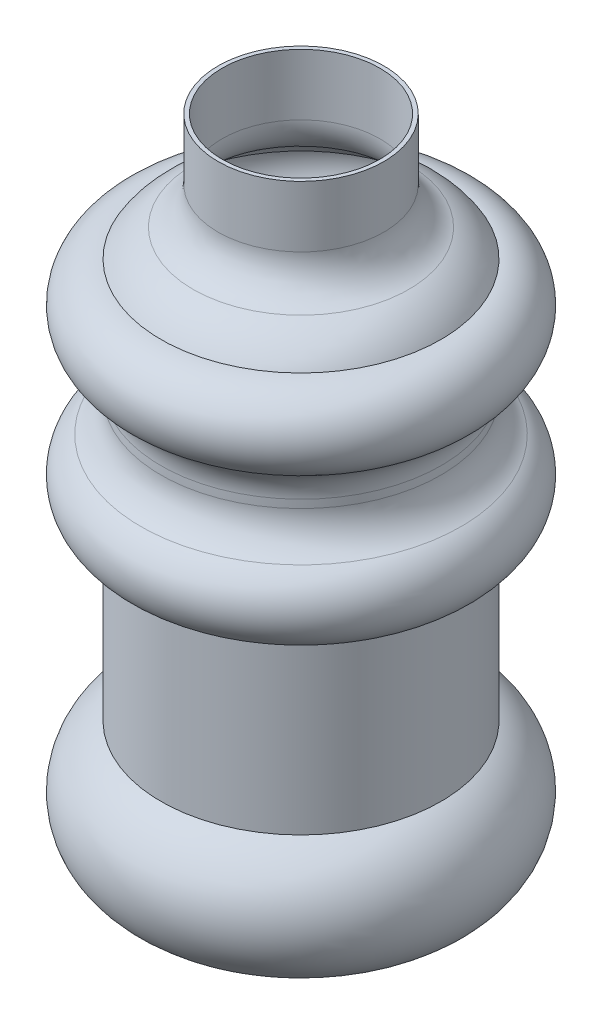
ISO-10303-21;
HEADER;
FILE_DESCRIPTION(('STEP AP214'),'2;1');
FILE_NAME('part.step','',(''),(''),'','','');
FILE_SCHEMA(('AUTOMOTIVE_DESIGN { 1 0 10303 214 1 1 1 1 }'));
ENDSEC;
DATA;
#1=APPLICATION_CONTEXT('core data for automotive mechanical design processes');
#2=APPLICATION_PROTOCOL_DEFINITION('international standard','automotive_design',2000,#1);
#3=PRODUCT_CONTEXT('',#1,'mechanical');
#4=PRODUCT('Part','Part','',(#3));
#5=PRODUCT_RELATED_PRODUCT_CATEGORY('part','',(#4));
#6=PRODUCT_DEFINITION_FORMATION('','',#4);
#7=PRODUCT_DEFINITION_CONTEXT('part definition',#1,'design');
#8=PRODUCT_DEFINITION('design','',#6,#7);
#9=PRODUCT_DEFINITION_SHAPE('','',#8);
#10=(LENGTH_UNIT() NAMED_UNIT(*) SI_UNIT(.MILLI.,.METRE.));
#11=(NAMED_UNIT(*) PLANE_ANGLE_UNIT() SI_UNIT($,.RADIAN.));
#12=(NAMED_UNIT(*) SI_UNIT($,.STERADIAN.) SOLID_ANGLE_UNIT());
#13=UNCERTAINTY_MEASURE_WITH_UNIT(LENGTH_MEASURE(1.E-05),#10,'distance_accuracy_value','');
#14=(GEOMETRIC_REPRESENTATION_CONTEXT(3) GLOBAL_UNCERTAINTY_ASSIGNED_CONTEXT((#13)) GLOBAL_UNIT_ASSIGNED_CONTEXT((#10,
#11,#12)) REPRESENTATION_CONTEXT('',''));
#15=CARTESIAN_POINT('',(0.,0.,0.));
#16=DIRECTION('',(0.,0.,1.));
#17=DIRECTION('',(1.,0.,0.));
#18=AXIS2_PLACEMENT_3D('',#15,#16,#17);
#19=CARTESIAN_POINT('',(0.,0.,0.));
#20=DIRECTION('',(0.,1.,0.));
#21=DIRECTION('',(0.,0.,1.));
#22=AXIS2_PLACEMENT_3D('',#19,#20,#21);
#23=PLANE('',#22);
#24=CARTESIAN_POINT('',(0.,0.,0.));
#25=DIRECTION('',(0.,-1.,0.));
#26=DIRECTION('',(0.,0.,-1.));
#27=AXIS2_PLACEMENT_3D('',#24,#25,#26);
#28=CIRCLE('',#27,85.);
#29=CARTESIAN_POINT('',(0.,0.,-85.));
#30=VERTEX_POINT('',#29);
#31=EDGE_CURVE('E75',#30,#30,#28,.T.);
#32=ORIENTED_EDGE('',*,*,#31,.T.);
#33=EDGE_LOOP('',(#32));
#34=FACE_BOUND('',#33,.T.);
#35=ADVANCED_FACE('F43',(#34),#23,.F.);
#36=CARTESIAN_POINT('',(0.,50.,0.));
#37=DIRECTION('',(0.,-1.,0.));
#38=DIRECTION('',(0.,0.,-1.));
#39=AXIS2_PLACEMENT_3D('',#36,#37,#38);
#40=TOROIDAL_SURFACE('',#39,85.,50.);
#41=ORIENTED_EDGE('',*,*,#31,.F.);
#42=EDGE_LOOP('',(#41));
#43=FACE_BOUND('',#42,.T.);
#44=CARTESIAN_POINT('',(0.,95.8257569495584,0.));
#45=DIRECTION('',(0.,-1.,0.));
#46=DIRECTION('',(0.,0.,-1.));
#47=AXIS2_PLACEMENT_3D('',#44,#45,#46);
#48=CIRCLE('',#47,105.);
#49=CARTESIAN_POINT('',(0.,95.8257569495584,-105.));
#50=VERTEX_POINT('',#49);
#51=EDGE_CURVE('E79',#50,#50,#48,.T.);
#52=ORIENTED_EDGE('',*,*,#51,.T.);
#53=EDGE_LOOP('',(#52));
#54=FACE_BOUND('',#53,.T.);
#55=ADVANCED_FACE('F156',(#43,#54),#40,.T.);
#56=CARTESIAN_POINT('',(0.,0.,0.));
#57=DIRECTION('',(0.,-1.,0.));
#58=DIRECTION('',(0.,0.,-1.));
#59=AXIS2_PLACEMENT_3D('',#56,#57,#58);
#60=CYLINDRICAL_SURFACE('',#59,105.);
#61=ORIENTED_EDGE('',*,*,#51,.F.);
#62=EDGE_LOOP('',(#61));
#63=FACE_BOUND('',#62,.T.);
#64=CARTESIAN_POINT('',(0.,225.825756949558,0.));
#65=DIRECTION('',(0.,-1.,0.));
#66=DIRECTION('',(0.,0.,-1.));
#67=AXIS2_PLACEMENT_3D('',#64,#65,#66);
#68=CIRCLE('',#67,105.);
#69=CARTESIAN_POINT('',(0.,225.825756949558,-105.));
#70=VERTEX_POINT('',#69);
#71=EDGE_CURVE('E83',#70,#70,#68,.T.);
#72=ORIENTED_EDGE('',*,*,#71,.T.);
#73=EDGE_LOOP('',(#72));
#74=FACE_BOUND('',#73,.T.);
#75=ADVANCED_FACE('F162',(#63,#74),#60,.T.);
#76=CARTESIAN_POINT('',(0.,255.825756949558,0.));
#77=DIRECTION('',(0.,-1.,0.));
#78=DIRECTION('',(0.,0.,-1.));
#79=AXIS2_PLACEMENT_3D('',#76,#77,#78);
#80=TOROIDAL_SURFACE('',#79,105.,30.);
#81=CARTESIAN_POINT('',(0.,281.806519063091,0.));
#82=DIRECTION('',(0.,-1.,0.));
#83=DIRECTION('',(0.,0.,-1.));
#84=AXIS2_PLACEMENT_3D('',#81,#82,#83);
#85=CIRCLE('',#84,120.);
#86=CARTESIAN_POINT('',(0.,281.806519063091,-120.));
#87=VERTEX_POINT('',#86);
#88=EDGE_CURVE('E10',#87,#87,#85,.T.);
#89=ORIENTED_EDGE('',*,*,#88,.T.);
#90=EDGE_LOOP('',(#89));
#91=FACE_BOUND('',#90,.T.);
#92=ORIENTED_EDGE('',*,*,#71,.F.);
#93=EDGE_LOOP('',(#92));
#94=FACE_BOUND('',#93,.T.);
#95=ADVANCED_FACE('F182',(#91,#94),#80,.T.);
#96=CARTESIAN_POINT('',(0.,0.,0.));
#97=DIRECTION('',(0.,-1.,0.));
#98=DIRECTION('',(0.,0.,-1.));
#99=AXIS2_PLACEMENT_3D('',#96,#97,#98);
#100=CYLINDRICAL_SURFACE('',#99,105.);
#101=CARTESIAN_POINT('',(0.,313.864232722492,0.));
#102=DIRECTION('',(0.,-1.,0.));
#103=DIRECTION('',(0.,0.,-1.));
#104=AXIS2_PLACEMENT_3D('',#101,#102,#103);
#105=CIRCLE('',#104,105.);
#106=CARTESIAN_POINT('',(0.,313.864232722492,-105.));
#107=VERTEX_POINT('',#106);
#108=EDGE_CURVE('E56',#107,#107,#105,.T.);
#109=ORIENTED_EDGE('',*,*,#108,.T.);
#110=EDGE_LOOP('',(#109));
#111=FACE_BOUND('',#110,.T.);
#112=CARTESIAN_POINT('',(0.,307.787281176625,0.));
#113=DIRECTION('',(0.,-1.,0.));
#114=DIRECTION('',(0.,0.,-1.));
#115=AXIS2_PLACEMENT_3D('',#112,#113,#114);
#116=CIRCLE('',#115,105.);
#117=CARTESIAN_POINT('',(0.,307.787281176625,-105.));
#118=VERTEX_POINT('',#117);
#119=EDGE_CURVE('E61',#118,#118,#116,.F.);
#120=ORIENTED_EDGE('',*,*,#119,.T.);
#121=EDGE_LOOP('',(#120));
#122=FACE_BOUND('',#121,.T.);
#123=ADVANCED_FACE('F178',(#111,#122),#100,.T.);
#124=CARTESIAN_POINT('',(0.,365.825756949559,0.));
#125=DIRECTION('',(0.,-1.,0.));
#126=DIRECTION('',(0.,0.,-1.));
#127=AXIS2_PLACEMENT_3D('',#124,#125,#126);
#128=TOROIDAL_SURFACE('',#127,105.,30.);
#129=CARTESIAN_POINT('',(0.,339.844994836025,0.));
#130=DIRECTION('',(0.,1.,0.));
#131=DIRECTION('',(0.,0.,1.));
#132=AXIS2_PLACEMENT_3D('',#129,#130,#131);
#133=CIRCLE('',#132,120.);
#134=CARTESIAN_POINT('',(0.,339.844994836025,120.));
#135=VERTEX_POINT('',#134);
#136=EDGE_CURVE('E51',#135,#135,#133,.T.);
#137=ORIENTED_EDGE('',*,*,#136,.T.);
#138=EDGE_LOOP('',(#137));
#139=FACE_BOUND('',#138,.T.);
#140=CARTESIAN_POINT('',(0.,395.825756949559,0.));
#141=DIRECTION('',(0.,-1.,0.));
#142=DIRECTION('',(0.,0.,-1.));
#143=AXIS2_PLACEMENT_3D('',#140,#141,#142);
#144=CIRCLE('',#143,105.);
#145=CARTESIAN_POINT('',(0.,395.825756949559,-105.));
#146=VERTEX_POINT('',#145);
#147=EDGE_CURVE('E87',#146,#146,#144,.T.);
#148=ORIENTED_EDGE('',*,*,#147,.T.);
#149=EDGE_LOOP('',(#148));
#150=FACE_BOUND('',#149,.T.);
#151=ADVANCED_FACE('F181',(#139,#150),#128,.T.);
#152=CARTESIAN_POINT('',(0.,370.,0.));
#153=DIRECTION('',(0.,-1.,0.));
#154=DIRECTION('',(0.,0.,-1.));
#155=AXIS2_PLACEMENT_3D('',#152,#153,#154);
#156=TOROIDAL_SURFACE('',#155,62.1860971414387,50.);
#157=CARTESIAN_POINT('',(0.,416.351240544348,0.));
#158=DIRECTION('',(0.,-1.,0.));
#159=DIRECTION('',(0.,0.,-1.));
#160=AXIS2_PLACEMENT_3D('',#157,#158,#159);
#161=CIRCLE('',#160,80.9360971414387);
#162=CARTESIAN_POINT('',(0.,416.351240544348,-80.9360971414387));
#163=VERTEX_POINT('',#162);
#164=EDGE_CURVE('E67',#163,#163,#161,.T.);
#165=ORIENTED_EDGE('',*,*,#164,.T.);
#166=EDGE_LOOP('',(#165));
#167=FACE_BOUND('',#166,.T.);
#168=ORIENTED_EDGE('',*,*,#147,.F.);
#169=EDGE_LOOP('',(#168));
#170=FACE_BOUND('',#169,.T.);
#171=ADVANCED_FACE('F190',(#167,#170),#156,.T.);
#172=CARTESIAN_POINT('',(0.,490.,0.));
#173=DIRECTION('',(0.,-1.,0.));
#174=DIRECTION('',(0.,0.,-1.));
#175=AXIS2_PLACEMENT_3D('',#172,#173,#174);
#176=CYLINDRICAL_SURFACE('',#175,62.1860971414387);
#177=CARTESIAN_POINT('',(0.,444.161984870957,0.));
#178=DIRECTION('',(0.,1.,0.));
#179=DIRECTION('',(0.,0.,1.));
#180=AXIS2_PLACEMENT_3D('',#177,#178,#179);
#181=CIRCLE('',#180,62.1860971414387);
#182=CARTESIAN_POINT('',(0.,444.161984870957,62.1860971414387));
#183=VERTEX_POINT('',#182);
#184=EDGE_CURVE('E71',#183,#183,#181,.T.);
#185=ORIENTED_EDGE('',*,*,#184,.T.);
#186=EDGE_LOOP('',(#185));
#187=FACE_BOUND('',#186,.T.);
#188=CARTESIAN_POINT('',(0.,490.,0.));
#189=DIRECTION('',(0.,1.,0.));
#190=DIRECTION('',(0.,0.,1.));
#191=AXIS2_PLACEMENT_3D('',#188,#189,#190);
#192=CIRCLE('',#191,62.1860971414387);
#193=CARTESIAN_POINT('',(0.,490.,62.1860971414387));
#194=VERTEX_POINT('',#193);
#195=EDGE_CURVE('E91',#194,#194,#192,.T.);
#196=ORIENTED_EDGE('',*,*,#195,.F.);
#197=EDGE_LOOP('',(#196));
#198=FACE_BOUND('',#197,.T.);
#199=ADVANCED_FACE('F230',(#187,#198),#176,.T.);
#200=CARTESIAN_POINT('',(0.,490.,0.));
#201=DIRECTION('',(0.,1.,0.));
#202=DIRECTION('',(0.,0.,1.));
#203=AXIS2_PLACEMENT_3D('',#200,#201,#202);
#204=PLANE('',#203);
#205=CARTESIAN_POINT('',(0.,490.,0.));
#206=DIRECTION('',(0.,1.,0.));
#207=DIRECTION('',(0.,0.,1.));
#208=AXIS2_PLACEMENT_3D('',#205,#206,#207);
#209=CIRCLE('',#208,59.1860971414387);
#210=CARTESIAN_POINT('',(0.,490.,59.1860971414387));
#211=VERTEX_POINT('',#210);
#212=EDGE_CURVE('E96',#211,#211,#209,.T.);
#213=ORIENTED_EDGE('',*,*,#212,.F.);
#214=EDGE_LOOP('',(#213));
#215=FACE_BOUND('',#214,.T.);
#216=ORIENTED_EDGE('',*,*,#195,.T.);
#217=EDGE_LOOP('',(#216));
#218=FACE_BOUND('',#217,.T.);
#219=ADVANCED_FACE('F169',(#215,#218),#204,.T.);
#220=CARTESIAN_POINT('',(0.,444.161984870957,0.));
#221=DIRECTION('',(0.,1.,0.));
#222=DIRECTION('',(0.,0.,1.));
#223=AXIS2_PLACEMENT_3D('',#220,#221,#222);
#224=TOROIDAL_SURFACE('',#223,92.1860971414387,30.);
#225=ORIENTED_EDGE('',*,*,#164,.F.);
#226=EDGE_LOOP('',(#225));
#227=FACE_BOUND('',#226,.T.);
#228=ORIENTED_EDGE('',*,*,#184,.F.);
#229=EDGE_LOOP('',(#228));
#230=FACE_BOUND('',#229,.T.);
#231=ADVANCED_FACE('F167',(#227,#230),#224,.F.);
#232=CARTESIAN_POINT('',(0.,313.864232722492,0.));
#233=DIRECTION('',(0.,-1.,0.));
#234=DIRECTION('',(0.,0.,-1.));
#235=AXIS2_PLACEMENT_3D('',#232,#233,#234);
#236=TOROIDAL_SURFACE('',#235,135.,30.);
#237=ORIENTED_EDGE('',*,*,#136,.F.);
#238=EDGE_LOOP('',(#237));
#239=FACE_BOUND('',#238,.T.);
#240=ORIENTED_EDGE('',*,*,#108,.F.);
#241=EDGE_LOOP('',(#240));
#242=FACE_BOUND('',#241,.T.);
#243=ADVANCED_FACE('F153',(#239,#242),#236,.F.);
#244=CARTESIAN_POINT('',(0.,307.787281176625,0.));
#245=DIRECTION('',(0.,-1.,0.));
#246=DIRECTION('',(0.,0.,-1.));
#247=AXIS2_PLACEMENT_3D('',#244,#245,#246);
#248=TOROIDAL_SURFACE('',#247,135.,30.);
#249=ORIENTED_EDGE('',*,*,#119,.F.);
#250=EDGE_LOOP('',(#249));
#251=FACE_BOUND('',#250,.T.);
#252=ORIENTED_EDGE('',*,*,#88,.F.);
#253=EDGE_LOOP('',(#252));
#254=FACE_BOUND('',#253,.T.);
#255=ADVANCED_FACE('F45',(#251,#254),#248,.F.);
#256=CARTESIAN_POINT('',(0.,2.99999999999999,0.));
#257=DIRECTION('',(0.,1.,0.));
#258=DIRECTION('',(0.,0.,1.));
#259=AXIS2_PLACEMENT_3D('',#256,#257,#258);
#260=PLANE('',#259);
#261=CARTESIAN_POINT('',(0.,2.99999999999999,0.));
#262=DIRECTION('',(0.,-1.,0.));
#263=DIRECTION('',(0.,0.,-1.));
#264=AXIS2_PLACEMENT_3D('',#261,#262,#263);
#265=CIRCLE('',#264,85.);
#266=CARTESIAN_POINT('',(0.,2.99999999999999,-85.));
#267=VERTEX_POINT('',#266);
#268=EDGE_CURVE('E106',#267,#267,#265,.T.);
#269=ORIENTED_EDGE('',*,*,#268,.F.);
#270=EDGE_LOOP('',(#269));
#271=FACE_BOUND('',#270,.T.);
#272=ADVANCED_FACE('F143',(#271),#260,.T.);
#273=CARTESIAN_POINT('',(0.,50.,0.));
#274=DIRECTION('',(0.,-1.,0.));
#275=DIRECTION('',(0.,0.,-1.));
#276=AXIS2_PLACEMENT_3D('',#273,#274,#275);
#277=TOROIDAL_SURFACE('',#276,85.,47.);
#278=ORIENTED_EDGE('',*,*,#268,.T.);
#279=EDGE_LOOP('',(#278));
#280=FACE_BOUND('',#279,.T.);
#281=CARTESIAN_POINT('',(0.,93.8178046004133,0.));
#282=DIRECTION('',(0.,-1.,0.));
#283=DIRECTION('',(0.,0.,-1.));
#284=AXIS2_PLACEMENT_3D('',#281,#282,#283);
#285=CIRCLE('',#284,102.);
#286=CARTESIAN_POINT('',(0.,93.8178046004133,-102.));
#287=VERTEX_POINT('',#286);
#288=EDGE_CURVE('E132',#287,#287,#285,.T.);
#289=ORIENTED_EDGE('',*,*,#288,.F.);
#290=EDGE_LOOP('',(#289));
#291=FACE_BOUND('',#290,.T.);
#292=ADVANCED_FACE('F140',(#280,#291),#277,.F.);
#293=CARTESIAN_POINT('',(0.,0.,0.));
#294=DIRECTION('',(0.,-1.,0.));
#295=DIRECTION('',(0.,0.,-1.));
#296=AXIS2_PLACEMENT_3D('',#293,#294,#295);
#297=CYLINDRICAL_SURFACE('',#296,102.);
#298=ORIENTED_EDGE('',*,*,#288,.T.);
#299=EDGE_LOOP('',(#298));
#300=FACE_BOUND('',#299,.T.);
#301=CARTESIAN_POINT('',(0.,228.992941219561,0.));
#302=DIRECTION('',(0.,1.,0.));
#303=DIRECTION('',(0.,0.,1.));
#304=AXIS2_PLACEMENT_3D('',#301,#302,#303);
#305=CIRCLE('',#304,102.);
#306=CARTESIAN_POINT('',(0.,228.992941219561,102.));
#307=VERTEX_POINT('',#306);
#308=EDGE_CURVE('E114',#307,#307,#305,.F.);
#309=ORIENTED_EDGE('',*,*,#308,.F.);
#310=EDGE_LOOP('',(#309));
#311=FACE_BOUND('',#310,.T.);
#312=ADVANCED_FACE('F150',(#300,#311),#297,.F.);
#313=CARTESIAN_POINT('',(0.,255.825756949558,0.));
#314=DIRECTION('',(0.,-1.,0.));
#315=DIRECTION('',(0.,0.,-1.));
#316=AXIS2_PLACEMENT_3D('',#313,#314,#315);
#317=TOROIDAL_SURFACE('',#316,105.,27.);
#318=CARTESIAN_POINT('',(0.,279.208442851738,0.));
#319=DIRECTION('',(0.,-1.,0.));
#320=DIRECTION('',(0.,0.,-1.));
#321=AXIS2_PLACEMENT_3D('',#318,#319,#320);
#322=CIRCLE('',#321,118.5);
#323=CARTESIAN_POINT('',(0.,279.208442851738,-118.5));
#324=VERTEX_POINT('',#323);
#325=EDGE_CURVE('E95',#324,#324,#322,.T.);
#326=ORIENTED_EDGE('',*,*,#325,.F.);
#327=EDGE_LOOP('',(#326));
#328=FACE_BOUND('',#327,.T.);
#329=ORIENTED_EDGE('',*,*,#308,.T.);
#330=EDGE_LOOP('',(#329));
#331=FACE_BOUND('',#330,.T.);
#332=ADVANCED_FACE('F282',(#328,#331),#317,.F.);
#333=CARTESIAN_POINT('',(0.,0.,0.));
#334=DIRECTION('',(0.,-1.,0.));
#335=DIRECTION('',(0.,0.,-1.));
#336=AXIS2_PLACEMENT_3D('',#333,#334,#335);
#337=CYLINDRICAL_SURFACE('',#336,102.);
#338=CARTESIAN_POINT('',(0.,313.864232722492,0.));
#339=DIRECTION('',(0.,-1.,0.));
#340=DIRECTION('',(0.,0.,-1.));
#341=AXIS2_PLACEMENT_3D('',#338,#339,#340);
#342=CIRCLE('',#341,102.);
#343=CARTESIAN_POINT('',(0.,313.864232722492,-102.));
#344=VERTEX_POINT('',#343);
#345=EDGE_CURVE('E119',#344,#344,#342,.T.);
#346=ORIENTED_EDGE('',*,*,#345,.F.);
#347=EDGE_LOOP('',(#346));
#348=FACE_BOUND('',#347,.T.);
#349=CARTESIAN_POINT('',(0.,307.787281176625,0.));
#350=DIRECTION('',(0.,-1.,0.));
#351=DIRECTION('',(0.,0.,-1.));
#352=AXIS2_PLACEMENT_3D('',#349,#350,#351);
#353=CIRCLE('',#352,102.);
#354=CARTESIAN_POINT('',(0.,307.787281176625,-102.));
#355=VERTEX_POINT('',#354);
#356=EDGE_CURVE('E110',#355,#355,#353,.F.);
#357=ORIENTED_EDGE('',*,*,#356,.F.);
#358=EDGE_LOOP('',(#357));
#359=FACE_BOUND('',#358,.T.);
#360=ADVANCED_FACE('F292',(#348,#359),#337,.F.);
#361=CARTESIAN_POINT('',(0.,365.825756949559,0.));
#362=DIRECTION('',(0.,-1.,0.));
#363=DIRECTION('',(0.,0.,-1.));
#364=AXIS2_PLACEMENT_3D('',#361,#362,#363);
#365=TOROIDAL_SURFACE('',#364,105.,27.);
#366=CARTESIAN_POINT('',(0.,342.443071047379,0.));
#367=DIRECTION('',(0.,-1.,0.));
#368=DIRECTION('',(0.,0.,-1.));
#369=AXIS2_PLACEMENT_3D('',#366,#367,#368);
#370=CIRCLE('',#369,118.5);
#371=CARTESIAN_POINT('',(0.,342.443071047379,-118.5));
#372=VERTEX_POINT('',#371);
#373=EDGE_CURVE('E115',#372,#372,#370,.F.);
#374=ORIENTED_EDGE('',*,*,#373,.F.);
#375=EDGE_LOOP('',(#374));
#376=FACE_BOUND('',#375,.T.);
#377=CARTESIAN_POINT('',(0.,392.772240550351,0.));
#378=DIRECTION('',(0.,-1.,0.));
#379=DIRECTION('',(0.,0.,-1.));
#380=AXIS2_PLACEMENT_3D('',#377,#378,#379);
#381=CIRCLE('',#380,103.300876239919);
#382=CARTESIAN_POINT('',(0.,392.772240550351,-103.300876239919));
#383=VERTEX_POINT('',#382);
#384=EDGE_CURVE('E100',#383,#383,#381,.T.);
#385=ORIENTED_EDGE('',*,*,#384,.F.);
#386=EDGE_LOOP('',(#385));
#387=FACE_BOUND('',#386,.T.);
#388=ADVANCED_FACE('F302',(#376,#387),#365,.F.);
#389=CARTESIAN_POINT('',(0.,370.,0.));
#390=DIRECTION('',(0.,-1.,0.));
#391=DIRECTION('',(0.,0.,-1.));
#392=AXIS2_PLACEMENT_3D('',#389,#390,#391);
#393=TOROIDAL_SURFACE('',#392,62.1860971414387,47.);
#394=CARTESIAN_POINT('',(0.,413.570166111687,0.));
#395=DIRECTION('',(0.,-1.,0.));
#396=DIRECTION('',(0.,0.,-1.));
#397=AXIS2_PLACEMENT_3D('',#394,#395,#396);
#398=CIRCLE('',#397,79.8110971414387);
#399=CARTESIAN_POINT('',(0.,413.570166111687,-79.8110971414387));
#400=VERTEX_POINT('',#399);
#401=EDGE_CURVE('E105',#400,#400,#398,.T.);
#402=ORIENTED_EDGE('',*,*,#401,.F.);
#403=EDGE_LOOP('',(#402));
#404=FACE_BOUND('',#403,.T.);
#405=ORIENTED_EDGE('',*,*,#384,.T.);
#406=EDGE_LOOP('',(#405));
#407=FACE_BOUND('',#406,.T.);
#408=ADVANCED_FACE('F312',(#404,#407),#393,.F.);
#409=CARTESIAN_POINT('',(0.,490.,0.));
#410=DIRECTION('',(0.,-1.,0.));
#411=DIRECTION('',(0.,0.,-1.));
#412=AXIS2_PLACEMENT_3D('',#409,#410,#411);
#413=CYLINDRICAL_SURFACE('',#412,59.1860971414387);
#414=CARTESIAN_POINT('',(0.,444.161984870957,0.));
#415=DIRECTION('',(0.,-1.,0.));
#416=DIRECTION('',(0.,0.,-1.));
#417=AXIS2_PLACEMENT_3D('',#414,#415,#416);
#418=CIRCLE('',#417,59.1860971414387);
#419=CARTESIAN_POINT('',(0.,444.161984870957,-59.1860971414387));
#420=VERTEX_POINT('',#419);
#421=EDGE_CURVE('E101',#420,#420,#418,.F.);
#422=ORIENTED_EDGE('',*,*,#421,.F.);
#423=EDGE_LOOP('',(#422));
#424=FACE_BOUND('',#423,.T.);
#425=ORIENTED_EDGE('',*,*,#212,.T.);
#426=EDGE_LOOP('',(#425));
#427=FACE_BOUND('',#426,.T.);
#428=ADVANCED_FACE('F322',(#424,#427),#413,.F.);
#429=CARTESIAN_POINT('',(0.,444.161984870957,0.));
#430=DIRECTION('',(0.,1.,0.));
#431=DIRECTION('',(0.,0.,1.));
#432=AXIS2_PLACEMENT_3D('',#429,#430,#431);
#433=TOROIDAL_SURFACE('',#432,92.1860971414387,33.);
#434=ORIENTED_EDGE('',*,*,#401,.T.);
#435=EDGE_LOOP('',(#434));
#436=FACE_BOUND('',#435,.T.);
#437=ORIENTED_EDGE('',*,*,#421,.T.);
#438=EDGE_LOOP('',(#437));
#439=FACE_BOUND('',#438,.T.);
#440=ADVANCED_FACE('F332',(#436,#439),#433,.T.);
#441=CARTESIAN_POINT('',(0.,313.864232722492,0.));
#442=DIRECTION('',(0.,-1.,0.));
#443=DIRECTION('',(0.,0.,-1.));
#444=AXIS2_PLACEMENT_3D('',#441,#442,#443);
#445=TOROIDAL_SURFACE('',#444,135.,33.);
#446=ORIENTED_EDGE('',*,*,#373,.T.);
#447=EDGE_LOOP('',(#446));
#448=FACE_BOUND('',#447,.T.);
#449=ORIENTED_EDGE('',*,*,#345,.T.);
#450=EDGE_LOOP('',(#449));
#451=FACE_BOUND('',#450,.T.);
#452=ADVANCED_FACE('F342',(#448,#451),#445,.T.);
#453=CARTESIAN_POINT('',(0.,307.787281176625,0.));
#454=DIRECTION('',(0.,-1.,0.));
#455=DIRECTION('',(0.,0.,-1.));
#456=AXIS2_PLACEMENT_3D('',#453,#454,#455);
#457=TOROIDAL_SURFACE('',#456,135.,33.);
#458=ORIENTED_EDGE('',*,*,#356,.T.);
#459=EDGE_LOOP('',(#458));
#460=FACE_BOUND('',#459,.T.);
#461=ORIENTED_EDGE('',*,*,#325,.T.);
#462=EDGE_LOOP('',(#461));
#463=FACE_BOUND('',#462,.T.);
#464=ADVANCED_FACE('F352',(#460,#463),#457,.T.);
#465=CLOSED_SHELL('',(#35,#55,#75,#95,#123,#151,#171,#199,#219,#231,#243,#255,#272,#292,#312,
#332,#360,#388,#408,#428,#440,#452,#464));
#466=MANIFOLD_SOLID_BREP('B2',#465);
#467=ADVANCED_BREP_SHAPE_REPRESENTATION('',(#18,#466),#14);
#468=SHAPE_DEFINITION_REPRESENTATION(#9,#467);
ENDSEC;
END-ISO-10303-21;
